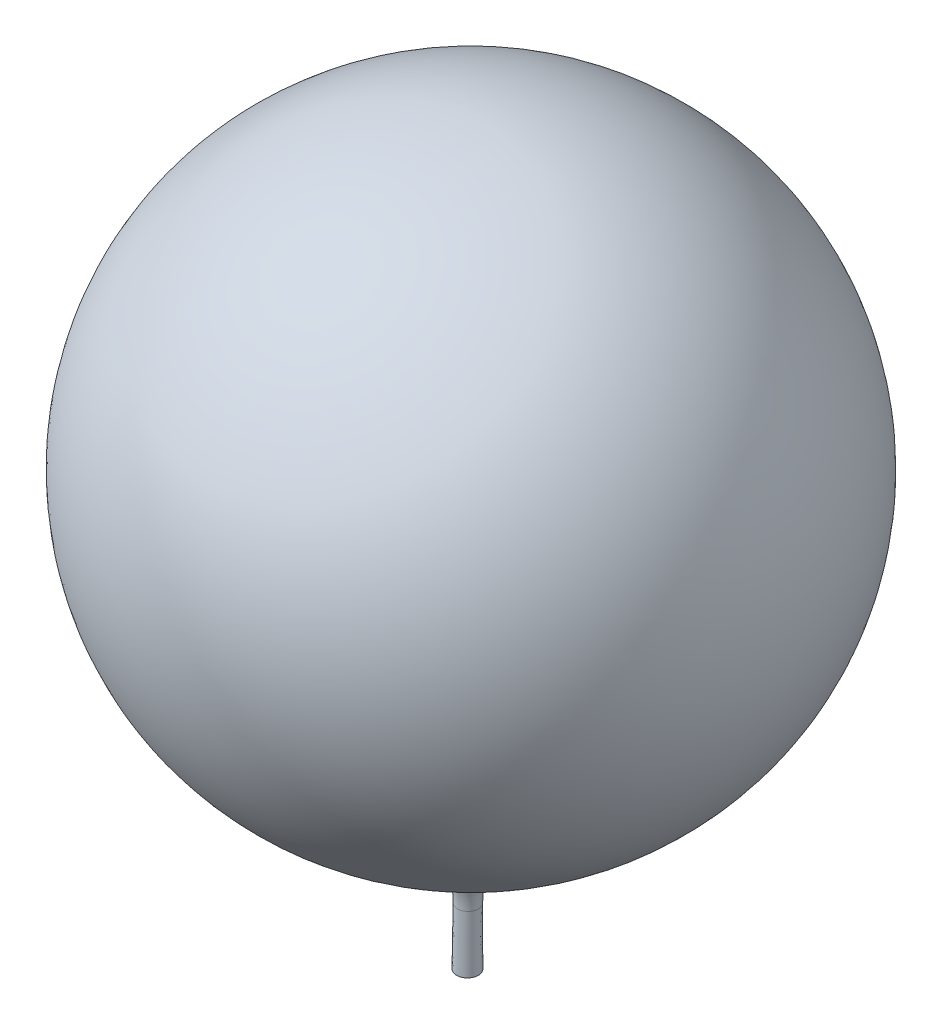
ISO-10303-21;
HEADER;
FILE_DESCRIPTION(('STEP AP214'),'2;1');
FILE_NAME('part.step','',(''),(''),'','','');
FILE_SCHEMA(('AUTOMOTIVE_DESIGN { 1 0 10303 214 1 1 1 1 }'));
ENDSEC;
DATA;
#1=APPLICATION_CONTEXT('core data for automotive mechanical design processes');
#2=APPLICATION_PROTOCOL_DEFINITION('international standard','automotive_design',2000,#1);
#3=PRODUCT_CONTEXT('',#1,'mechanical');
#4=PRODUCT('Part','Part','',(#3));
#5=PRODUCT_RELATED_PRODUCT_CATEGORY('part','',(#4));
#6=PRODUCT_DEFINITION_FORMATION('','',#4);
#7=PRODUCT_DEFINITION_CONTEXT('part definition',#1,'design');
#8=PRODUCT_DEFINITION('design','',#6,#7);
#9=PRODUCT_DEFINITION_SHAPE('','',#8);
#10=(LENGTH_UNIT() NAMED_UNIT(*) SI_UNIT(.MILLI.,.METRE.));
#11=(NAMED_UNIT(*) PLANE_ANGLE_UNIT() SI_UNIT($,.RADIAN.));
#12=(NAMED_UNIT(*) SI_UNIT($,.STERADIAN.) SOLID_ANGLE_UNIT());
#13=UNCERTAINTY_MEASURE_WITH_UNIT(LENGTH_MEASURE(1.E-05),#10,'distance_accuracy_value','');
#14=(GEOMETRIC_REPRESENTATION_CONTEXT(3) GLOBAL_UNCERTAINTY_ASSIGNED_CONTEXT((#13)) GLOBAL_UNIT_ASSIGNED_CONTEXT((#10,
#11,#12)) REPRESENTATION_CONTEXT('',''));
#15=CARTESIAN_POINT('',(0.,0.,0.));
#16=DIRECTION('',(0.,0.,1.));
#17=DIRECTION('',(1.,0.,0.));
#18=AXIS2_PLACEMENT_3D('',#15,#16,#17);
#19=CARTESIAN_POINT('',(-15.0000000000001,0.123039774051882,0.));
#20=DIRECTION('',(0.,0.,-1.));
#21=DIRECTION('',(-0.999966359950892,0.00820237566585309,0.));
#22=AXIS2_PLACEMENT_3D('',#19,#20,#21);
#23=CIRCLE('',#22,914.4);
#24=TRIMMED_CURVE('',#23,(PARAMETER_VALUE(-1.57899879443809)),
(PARAMETER_VALUE(1.57899879443809)),.T.,.PARAMETER.);
#25=CARTESIAN_POINT('',(-7.50000000000007,0.0615198870259626,0.));
#26=DIRECTION('',(0.00820237566585309,0.999966359950892,0.));
#27=AXIS1_PLACEMENT('',#25,#26);
#28=SURFACE_OF_REVOLUTION('',#24,#27);
#29=CARTESIAN_POINT('',(-14.7524484403137,-884.097504648174,0.));
#30=DIRECTION('',(0.00820237566585309,0.999966359950892,0.));
#31=DIRECTION('',(-0.999966359950892,0.00820237566585309,0.));
#32=AXIS2_PLACEMENT_3D('',#29,#30,#31);
#33=CIRCLE('',#32,240.604480765965);
#34=CARTESIAN_POINT('',(-255.34883525973,-882.123976310044,0.));
#35=VERTEX_POINT('',#34);
#36=EDGE_CURVE('E46',#35,#35,#33,.T.);
#37=ORIENTED_EDGE('',*,*,#36,.T.);
#38=EDGE_LOOP('',(#37));
#39=FACE_BOUND('',#38,.T.);
#40=CARTESIAN_POINT('',(0.,914.4,0.));
#41=VERTEX_POINT('',#40);
#42=VERTEX_LOOP('',#41);
#43=FACE_BOUND('',#42,.T.);
#44=ADVANCED_FACE('F37',(#39,#43),#28,.T.);
#45=CARTESIAN_POINT('',(-15.0000000000001,-914.276960225948,0.));
#46=DIRECTION('',(-0.00820237566585309,-0.999966359950892,0.));
#47=DIRECTION('',(0.999966359950892,-0.00820237566585309,0.));
#48=AXIS2_PLACEMENT_3D('',#45,#46,#47);
#49=CONICAL_SURFACE('',#48,2.22051381085215E-13,0.00820246764319694);
#50=CARTESIAN_POINT('',(-18.4426102343674,-1333.97176146764,0.));
#51=DIRECTION('',(0.00820237566585309,0.999966359950892,0.));
#52=DIRECTION('',(-0.999966359950892,0.00820237566585309,0.));
#53=AXIS2_PLACEMENT_3D('',#50,#51,#52);
#54=CIRCLE('',#53,3.44272604784057);
#55=CARTESIAN_POINT('',(-21.8852204687344,-1333.94352293528,0.));
#56=VERTEX_POINT('',#55);
#57=EDGE_CURVE('E79',#56,#56,#54,.T.);
#58=ORIENTED_EDGE('',*,*,#57,.F.);
#59=EDGE_LOOP('',(#58));
#60=FACE_BOUND('',#59,.T.);
#61=CARTESIAN_POINT('',(-15.0000000000001,-914.276960225948,0.));
#62=VERTEX_POINT('',#61);
#63=VERTEX_LOOP('',#62);
#64=FACE_BOUND('',#63,.T.);
#65=ADVANCED_FACE('F53',(#60,#64),#49,.F.);
#66=CARTESIAN_POINT('',(-18.4426102343674,-1333.97176146764,0.));
#67=DIRECTION('',(0.00820237566585309,0.999966359950892,0.));
#68=DIRECTION('',(-0.999966359950892,0.00820237566585309,0.));
#69=AXIS2_PLACEMENT_3D('',#66,#67,#68);
#70=CONICAL_SURFACE('',#69,3.44272604784057,1.5625938591517);
#71=CARTESIAN_POINT('',(-18.4405918653705,-1333.72569847552,0.));
#72=DIRECTION('',(0.00820237566585309,0.999966359950892,0.));
#73=DIRECTION('',(-0.999966359950892,0.00820237566585309,0.));
#74=AXIS2_PLACEMENT_3D('',#71,#72,#73);
#75=CIRCLE('',#74,33.4417168463673);
#76=CARTESIAN_POINT('',(-51.8811837307335,-1333.45139695103,0.));
#77=VERTEX_POINT('',#76);
#78=EDGE_CURVE('E77',#77,#77,#75,.T.);
#79=CARTESIAN_POINT('',(-51.8811837307335,-1333.45139695103,0.));
#80=CARTESIAN_POINT('',(-51.5687257800876,-1333.45652326337,0.));
#81=CARTESIAN_POINT('',(-51.2562678294418,-1333.4616495757,0.));
#82=CARTESIAN_POINT('',(-50.6313519281502,-1333.47190220037,0.));
#83=CARTESIAN_POINT('',(-50.3188939775044,-1333.47702851271,0.));
#84=CARTESIAN_POINT('',(-49.6939780762127,-1333.48728113738,0.));
#85=CARTESIAN_POINT('',(-49.3815201255669,-1333.49240744972,0.));
#86=CARTESIAN_POINT('',(-48.7566042242752,-1333.50266007439,0.));
#87=CARTESIAN_POINT('',(-48.4441462736294,-1333.50778638673,0.));
#88=CARTESIAN_POINT('',(-47.8192303723378,-1333.5180390114,0.));
#89=CARTESIAN_POINT('',(-47.5067724216919,-1333.52316532373,0.));
#90=CARTESIAN_POINT('',(-46.8818565204003,-1333.53341794841,0.));
#91=CARTESIAN_POINT('',(-46.5693985697545,-1333.53854426074,0.));
#92=CARTESIAN_POINT('',(-45.9444826684628,-1333.54879688541,0.));
#93=CARTESIAN_POINT('',(-45.632024717817,-1333.55392319775,0.));
#94=CARTESIAN_POINT('',(-45.0071088165254,-1333.56417582242,0.));
#95=CARTESIAN_POINT('',(-44.6946508658795,-1333.56930213476,0.));
#96=CARTESIAN_POINT('',(-44.0697349645879,-1333.57955475943,0.));
#97=CARTESIAN_POINT('',(-43.7572770139421,-1333.58468107177,0.));
#98=CARTESIAN_POINT('',(-43.1323611126504,-1333.59493369644,0.));
#99=CARTESIAN_POINT('',(-42.8199031620046,-1333.60006000877,0.));
#100=CARTESIAN_POINT('',(-42.1949872607129,-1333.61031263345,0.));
#101=CARTESIAN_POINT('',(-41.8825293100671,-1333.61543894578,0.));
#102=CARTESIAN_POINT('',(-41.2576134087755,-1333.62569157045,0.));
#103=CARTESIAN_POINT('',(-40.9451554581296,-1333.63081788279,0.));
#104=CARTESIAN_POINT('',(-40.320239556838,-1333.64107050746,0.));
#105=CARTESIAN_POINT('',(-40.0077816061922,-1333.6461968198,0.));
#106=CARTESIAN_POINT('',(-39.3828657049005,-1333.65644944447,0.));
#107=CARTESIAN_POINT('',(-39.0704077542547,-1333.6615757568,0.));
#108=CARTESIAN_POINT('',(-38.4454918529631,-1333.67182838148,0.));
#109=CARTESIAN_POINT('',(-38.1330339023172,-1333.67695469381,0.));
#110=CARTESIAN_POINT('',(-37.5081180010256,-1333.68720731848,0.));
#111=CARTESIAN_POINT('',(-37.1956600503798,-1333.69233363082,0.));
#112=CARTESIAN_POINT('',(-36.5707441490881,-1333.70258625549,0.));
#113=CARTESIAN_POINT('',(-36.2582861984423,-1333.70771256783,0.));
#114=CARTESIAN_POINT('',(-35.6333702971506,-1333.7179651925,0.));
#115=CARTESIAN_POINT('',(-35.3209123465048,-1333.72309150484,0.));
#116=CARTESIAN_POINT('',(-34.6959964452132,-1333.73334412951,0.));
#117=CARTESIAN_POINT('',(-34.3835384945673,-1333.73847044184,0.));
#118=CARTESIAN_POINT('',(-33.7586225932757,-1333.74872306652,0.));
#119=CARTESIAN_POINT('',(-33.4461646426299,-1333.75384937885,0.));
#120=CARTESIAN_POINT('',(-32.8212487413382,-1333.76410200352,0.));
#121=CARTESIAN_POINT('',(-32.5087907906924,-1333.76922831586,0.));
#122=CARTESIAN_POINT('',(-31.8838748894008,-1333.77948094053,0.));
#123=CARTESIAN_POINT('',(-31.5714169387549,-1333.78460725287,0.));
#124=CARTESIAN_POINT('',(-30.9465010374633,-1333.79485987754,0.));
#125=CARTESIAN_POINT('',(-30.6340430868175,-1333.79998618988,0.));
#126=CARTESIAN_POINT('',(-30.0091271855258,-1333.81023881455,0.));
#127=CARTESIAN_POINT('',(-29.69666923488,-1333.81536512688,0.));
#128=CARTESIAN_POINT('',(-29.0717533335883,-1333.82561775156,0.));
#129=CARTESIAN_POINT('',(-28.7592953829425,-1333.83074406389,0.));
#130=CARTESIAN_POINT('',(-28.1343794816509,-1333.84099668856,0.));
#131=CARTESIAN_POINT('',(-27.821921531005,-1333.8461230009,0.));
#132=CARTESIAN_POINT('',(-27.1970056297134,-1333.85637562557,0.));
#133=CARTESIAN_POINT('',(-26.8845476790676,-1333.86150193791,0.));
#134=CARTESIAN_POINT('',(-26.2596317777759,-1333.87175456258,0.));
#135=CARTESIAN_POINT('',(-25.9471738271301,-1333.87688087492,0.));
#136=CARTESIAN_POINT('',(-25.3222579258385,-1333.88713349959,0.));
#137=CARTESIAN_POINT('',(-25.0097999751926,-1333.89225981192,0.));
#138=CARTESIAN_POINT('',(-24.384884073901,-1333.90251243659,0.));
#139=CARTESIAN_POINT('',(-24.0724261232552,-1333.90763874893,0.));
#140=CARTESIAN_POINT('',(-23.4475102219635,-1333.9178913736,0.));
#141=CARTESIAN_POINT('',(-23.1350522713177,-1333.92301768594,0.));
#142=CARTESIAN_POINT('',(-22.510136370026,-1333.93327031061,0.));
#143=CARTESIAN_POINT('',(-22.1976784193802,-1333.93839662295,0.));
#144=CARTESIAN_POINT('',(-21.8852204687344,-1333.94352293528,0.));
#145=B_SPLINE_CURVE_WITH_KNOTS('',3,(#79,#80,#81,#82,#83,#84,#85,#86,#87,#88,#89,#90,#91,#92,
#93,#94,#95,#96,#97,#98,#99,#100,#101,#102,#103,#104,#105,#106,#107,#108,#109,#110,#111,#112,
#113,#114,#115,#116,#117,#118,#119,#120,#121,#122,#123,#124,#125,#126,#127,#128,#129,#130,#131,
#132,#133,#134,#135,#136,#137,#138,#139,#140,#141,#142,#143,#144),.UNSPECIFIED.,.F.,.F.,(4,2,2,
2,2,2,2,2,2,2,2,2,2,2,2,2,2,2,2,2,2,2,2,2,2,2,2,2,2,2,2,2,4),(0.,0.937499999999777,
1.87499999999955,2.81249999999932,3.74999999999912,4.68749999999889,5.62499999999866,
6.56249999999845,7.49999999999823,8.437499999998,9.37499999999779,10.3124999999976,
11.2499999999973,12.1874999999971,13.1249999999969,14.0624999999967,14.9999999999964,
15.9374999999962,16.874999999996,17.8124999999958,18.7499999999956,19.6874999999953,
20.6249999999951,21.5624999999949,22.4999999999947,23.4374999999945,24.3749999999943,
25.312499999994,26.2499999999938,27.1874999999936,28.1249999999934,29.0624999999931,
29.9999999999929),.UNSPECIFIED.);
#146=EDGE_CURVE('BSEAM58',#77,#56,#145,.T.);
#147=ORIENTED_EDGE('',*,*,#78,.F.);
#148=ORIENTED_EDGE('',*,*,#57,.T.);
#149=ORIENTED_EDGE('',*,*,#146,.T.);
#150=ORIENTED_EDGE('',*,*,#146,.F.);
#151=EDGE_LOOP('',(#147,#149,#148,#150));
#152=FACE_BOUND('',#151,.T.);
#153=ADVANCED_FACE('F58',(#152),#70,.T.);
#154=CARTESIAN_POINT('',(-18.4405918653705,-1333.72569847552,0.));
#155=DIRECTION('',(-0.00820237566585309,-0.999966359950892,0.));
#156=DIRECTION('',(0.999966359950892,-0.00820237566585309,0.));
#157=AXIS2_PLACEMENT_3D('',#154,#155,#156);
#158=CONICAL_SURFACE('',#157,33.4417168463673,0.00820246764319774);
#159=CARTESIAN_POINT('',(-16.9920712877055,-1157.13395135624,0.));
#160=DIRECTION('',(-0.00820237566585309,-0.999966359950892,0.));
#161=DIRECTION('',(0.999966359950892,-0.00820237566585309,0.));
#162=AXIS2_PLACEMENT_3D('',#159,#160,#161);
#163=CIRCLE('',#162,31.9931475387597);
#164=CARTESIAN_POINT('',(14.9999999999998,-1157.39637117109,0.));
#165=VERTEX_POINT('',#164);
#166=EDGE_CURVE('E11',#165,#165,#163,.T.);
#167=ORIENTED_EDGE('',*,*,#166,.T.);
#168=EDGE_LOOP('',(#167));
#169=FACE_BOUND('',#168,.T.);
#170=ORIENTED_EDGE('',*,*,#78,.T.);
#171=EDGE_LOOP('',(#170));
#172=FACE_BOUND('',#171,.T.);
#173=ADVANCED_FACE('F65',(#169,#172),#158,.T.);
#174=CARTESIAN_POINT('',(-16.9732331770676,-1154.83736342973,0.));
#175=DIRECTION('',(0.00820237566585309,0.999966359950892,0.));
#176=DIRECTION('',(-0.999966359950892,0.00820237566585309,0.));
#177=AXIS2_PLACEMENT_3D('',#174,#175,#176);
#178=TOROIDAL_SURFACE('',#177,311.983728325009,280.);
#179=ORIENTED_EDGE('',*,*,#166,.F.);
#180=EDGE_LOOP('',(#179));
#181=FACE_BOUND('',#180,.T.);
#182=ORIENTED_EDGE('',*,*,#36,.F.);
#183=EDGE_LOOP('',(#182));
#184=FACE_BOUND('',#183,.T.);
#185=ADVANCED_FACE('F39',(#181,#184),#178,.F.);
#186=CLOSED_SHELL('',(#44,#65,#153,#173,#185));
#187=MANIFOLD_SOLID_BREP('B2',#186);
#188=ADVANCED_BREP_SHAPE_REPRESENTATION('',(#18,#187),#14);
#189=SHAPE_DEFINITION_REPRESENTATION(#9,#188);
ENDSEC;
END-ISO-10303-21;
